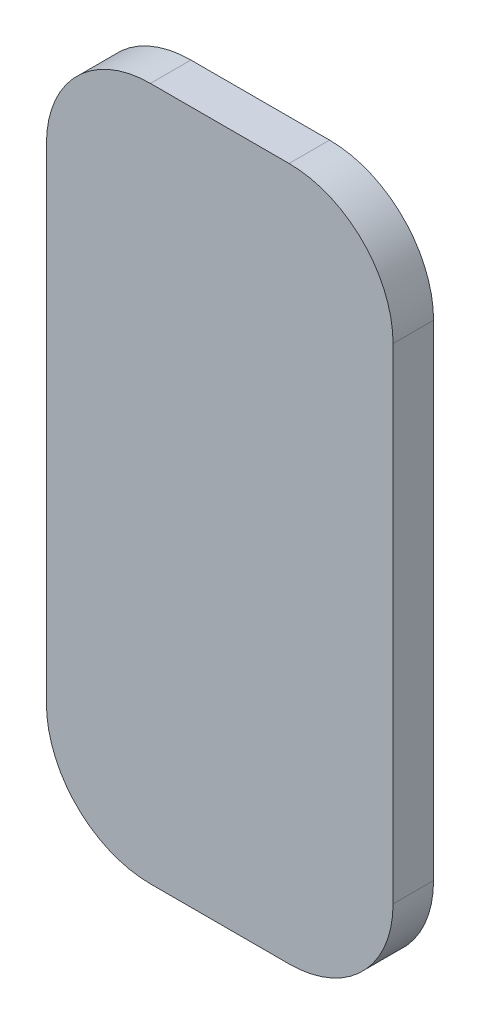
ISO-10303-21;
HEADER;
FILE_DESCRIPTION(('STEP AP214'),'2;1');
FILE_NAME('part.step','',(''),(''),'','','');
FILE_SCHEMA(('AUTOMOTIVE_DESIGN { 1 0 10303 214 1 1 1 1 }'));
ENDSEC;
DATA;
#1=APPLICATION_CONTEXT('core data for automotive mechanical design processes');
#2=APPLICATION_PROTOCOL_DEFINITION('international standard','automotive_design',2000,#1);
#3=PRODUCT_CONTEXT('',#1,'mechanical');
#4=PRODUCT('Part','Part','',(#3));
#5=PRODUCT_RELATED_PRODUCT_CATEGORY('part','',(#4));
#6=PRODUCT_DEFINITION_FORMATION('','',#4);
#7=PRODUCT_DEFINITION_CONTEXT('part definition',#1,'design');
#8=PRODUCT_DEFINITION('design','',#6,#7);
#9=PRODUCT_DEFINITION_SHAPE('','',#8);
#10=(LENGTH_UNIT() NAMED_UNIT(*) SI_UNIT(.MILLI.,.METRE.));
#11=(NAMED_UNIT(*) PLANE_ANGLE_UNIT() SI_UNIT($,.RADIAN.));
#12=(NAMED_UNIT(*) SI_UNIT($,.STERADIAN.) SOLID_ANGLE_UNIT());
#13=UNCERTAINTY_MEASURE_WITH_UNIT(LENGTH_MEASURE(1.E-05),#10,'distance_accuracy_value','');
#14=(GEOMETRIC_REPRESENTATION_CONTEXT(3) GLOBAL_UNCERTAINTY_ASSIGNED_CONTEXT((#13)) GLOBAL_UNIT_ASSIGNED_CONTEXT((#10,
#11,#12)) REPRESENTATION_CONTEXT('',''));
#15=CARTESIAN_POINT('',(0.,0.,0.));
#16=DIRECTION('',(0.,0.,1.));
#17=DIRECTION('',(1.,0.,0.));
#18=AXIS2_PLACEMENT_3D('',#15,#16,#17);
#19=CARTESIAN_POINT('',(0.,0.,-1.1684));
#20=DIRECTION('',(-1.,0.,0.));
#21=DIRECTION('',(0.,-1.,0.));
#22=AXIS2_PLACEMENT_3D('',#19,#20,#21);
#23=PLANE('',#22);
#24=DIRECTION('',(0.,-1.,0.));
#25=VECTOR('',#24,1.);
#26=CARTESIAN_POINT('',(0.,0.,0.));
#27=LINE('',#26,#25);
#28=CARTESIAN_POINT('',(0.,17.,0.));
#29=VERTEX_POINT('',#28);
#30=CARTESIAN_POINT('',(0.,3.,0.));
#31=VERTEX_POINT('',#30);
#32=EDGE_CURVE('E162',#29,#31,#27,.T.);
#33=ORIENTED_EDGE('',*,*,#32,.F.);
#34=DIRECTION('',(0.,0.,1.));
#35=VECTOR('',#34,1.);
#36=CARTESIAN_POINT('',(0.,17.,-1.1684));
#37=LINE('',#36,#35);
#38=CARTESIAN_POINT('',(0.,17.,-1.1684));
#39=VERTEX_POINT('',#38);
#40=EDGE_CURVE('E142',#29,#39,#37,.F.);
#41=ORIENTED_EDGE('',*,*,#40,.T.);
#42=DIRECTION('',(0.,-1.,0.));
#43=VECTOR('',#42,1.);
#44=CARTESIAN_POINT('',(0.,0.,-1.1684));
#45=LINE('',#44,#43);
#46=CARTESIAN_POINT('',(0.,3.,-1.1684));
#47=VERTEX_POINT('',#46);
#48=EDGE_CURVE('E123',#39,#47,#45,.T.);
#49=ORIENTED_EDGE('',*,*,#48,.T.);
#50=DIRECTION('',(0.,0.,1.));
#51=VECTOR('',#50,1.);
#52=CARTESIAN_POINT('',(0.,3.,-1.1684));
#53=LINE('',#52,#51);
#54=EDGE_CURVE('E139',#47,#31,#53,.T.);
#55=ORIENTED_EDGE('',*,*,#54,.T.);
#56=EDGE_LOOP('',(#33,#41,#49,#55));
#57=FACE_BOUND('',#56,.T.);
#58=ADVANCED_FACE('F37',(#57),#23,.T.);
#59=CARTESIAN_POINT('',(0.,20.,-1.1684));
#60=DIRECTION('',(0.,1.,0.));
#61=DIRECTION('',(0.,0.,1.));
#62=AXIS2_PLACEMENT_3D('',#59,#60,#61);
#63=PLANE('',#62);
#64=DIRECTION('',(-1.,0.,0.));
#65=VECTOR('',#64,1.);
#66=CARTESIAN_POINT('',(0.,20.,-1.1684));
#67=LINE('',#66,#65);
#68=CARTESIAN_POINT('',(7.,20.,-1.1684));
#69=VERTEX_POINT('',#68);
#70=CARTESIAN_POINT('',(3.,20.,-1.1684));
#71=VERTEX_POINT('',#70);
#72=EDGE_CURVE('E127',#69,#71,#67,.T.);
#73=ORIENTED_EDGE('',*,*,#72,.T.);
#74=DIRECTION('',(0.,0.,1.));
#75=VECTOR('',#74,1.);
#76=CARTESIAN_POINT('',(3.,20.,-1.1684));
#77=LINE('',#76,#75);
#78=CARTESIAN_POINT('',(3.,20.,0.));
#79=VERTEX_POINT('',#78);
#80=EDGE_CURVE('E114',#71,#79,#77,.T.);
#81=ORIENTED_EDGE('',*,*,#80,.T.);
#82=DIRECTION('',(-1.,0.,0.));
#83=VECTOR('',#82,1.);
#84=CARTESIAN_POINT('',(0.,20.,0.));
#85=LINE('',#84,#83);
#86=CARTESIAN_POINT('',(7.,20.,0.));
#87=VERTEX_POINT('',#86);
#88=EDGE_CURVE('E106',#87,#79,#85,.T.);
#89=ORIENTED_EDGE('',*,*,#88,.F.);
#90=DIRECTION('',(0.,0.,1.));
#91=VECTOR('',#90,1.);
#92=CARTESIAN_POINT('',(7.,20.,-1.1684));
#93=LINE('',#92,#91);
#94=EDGE_CURVE('E120',#87,#69,#93,.F.);
#95=ORIENTED_EDGE('',*,*,#94,.T.);
#96=EDGE_LOOP('',(#73,#81,#89,#95));
#97=FACE_BOUND('',#96,.T.);
#98=ADVANCED_FACE('F119',(#97),#63,.T.);
#99=CARTESIAN_POINT('',(10.,0.,-1.1684));
#100=DIRECTION('',(1.,0.,0.));
#101=DIRECTION('',(0.,1.,0.));
#102=AXIS2_PLACEMENT_3D('',#99,#100,#101);
#103=PLANE('',#102);
#104=DIRECTION('',(0.,1.,0.));
#105=VECTOR('',#104,1.);
#106=CARTESIAN_POINT('',(10.,0.,0.));
#107=LINE('',#106,#105);
#108=CARTESIAN_POINT('',(10.,3.,0.));
#109=VERTEX_POINT('',#108);
#110=CARTESIAN_POINT('',(10.,17.,0.));
#111=VERTEX_POINT('',#110);
#112=EDGE_CURVE('E108',#109,#111,#107,.T.);
#113=ORIENTED_EDGE('',*,*,#112,.F.);
#114=DIRECTION('',(0.,0.,1.));
#115=VECTOR('',#114,1.);
#116=CARTESIAN_POINT('',(10.,3.,-1.1684));
#117=LINE('',#116,#115);
#118=CARTESIAN_POINT('',(10.,3.,-1.1684));
#119=VERTEX_POINT('',#118);
#120=EDGE_CURVE('E11',#109,#119,#117,.F.);
#121=ORIENTED_EDGE('',*,*,#120,.T.);
#122=DIRECTION('',(0.,1.,0.));
#123=VECTOR('',#122,1.);
#124=CARTESIAN_POINT('',(10.,0.,-1.1684));
#125=LINE('',#124,#123);
#126=CARTESIAN_POINT('',(10.,17.,-1.1684));
#127=VERTEX_POINT('',#126);
#128=EDGE_CURVE('E130',#119,#127,#125,.T.);
#129=ORIENTED_EDGE('',*,*,#128,.T.);
#130=DIRECTION('',(0.,0.,1.));
#131=VECTOR('',#130,1.);
#132=CARTESIAN_POINT('',(10.,17.,-1.1684));
#133=LINE('',#132,#131);
#134=EDGE_CURVE('E45',#127,#111,#133,.T.);
#135=ORIENTED_EDGE('',*,*,#134,.T.);
#136=EDGE_LOOP('',(#113,#121,#129,#135));
#137=FACE_BOUND('',#136,.T.);
#138=ADVANCED_FACE('F155',(#137),#103,.T.);
#139=CARTESIAN_POINT('',(0.,0.,-1.1684));
#140=DIRECTION('',(0.,-1.,0.));
#141=DIRECTION('',(0.,0.,-1.));
#142=AXIS2_PLACEMENT_3D('',#139,#140,#141);
#143=PLANE('',#142);
#144=DIRECTION('',(1.,0.,0.));
#145=VECTOR('',#144,1.);
#146=CARTESIAN_POINT('',(0.,0.,0.));
#147=LINE('',#146,#145);
#148=CARTESIAN_POINT('',(3.,0.,0.));
#149=VERTEX_POINT('',#148);
#150=CARTESIAN_POINT('',(7.,0.,0.));
#151=VERTEX_POINT('',#150);
#152=EDGE_CURVE('E165',#149,#151,#147,.T.);
#153=ORIENTED_EDGE('',*,*,#152,.F.);
#154=DIRECTION('',(0.,0.,1.));
#155=VECTOR('',#154,1.);
#156=CARTESIAN_POINT('',(3.,0.,-1.1684));
#157=LINE('',#156,#155);
#158=CARTESIAN_POINT('',(3.,0.,-1.1684));
#159=VERTEX_POINT('',#158);
#160=EDGE_CURVE('E59',#149,#159,#157,.F.);
#161=ORIENTED_EDGE('',*,*,#160,.T.);
#162=DIRECTION('',(1.,0.,0.));
#163=VECTOR('',#162,1.);
#164=CARTESIAN_POINT('',(0.,0.,-1.1684));
#165=LINE('',#164,#163);
#166=CARTESIAN_POINT('',(7.,0.,-1.1684));
#167=VERTEX_POINT('',#166);
#168=EDGE_CURVE('E157',#159,#167,#165,.T.);
#169=ORIENTED_EDGE('',*,*,#168,.T.);
#170=DIRECTION('',(0.,0.,1.));
#171=VECTOR('',#170,1.);
#172=CARTESIAN_POINT('',(7.,0.,-1.1684));
#173=LINE('',#172,#171);
#174=EDGE_CURVE('E150',#167,#151,#173,.T.);
#175=ORIENTED_EDGE('',*,*,#174,.T.);
#176=EDGE_LOOP('',(#153,#161,#169,#175));
#177=FACE_BOUND('',#176,.T.);
#178=ADVANCED_FACE('F167',(#177),#143,.T.);
#179=CARTESIAN_POINT('',(0.,0.,-1.1684));
#180=DIRECTION('',(0.,0.,-1.));
#181=DIRECTION('',(-1.,0.,0.));
#182=AXIS2_PLACEMENT_3D('',#179,#180,#181);
#183=PLANE('',#182);
#184=ORIENTED_EDGE('',*,*,#48,.F.);
#185=CARTESIAN_POINT('',(3.,17.,-1.1684));
#186=DIRECTION('',(0.,0.,-1.));
#187=DIRECTION('',(-1.,0.,0.));
#188=AXIS2_PLACEMENT_3D('',#185,#186,#187);
#189=CIRCLE('',#188,3.);
#190=EDGE_CURVE('E148',#39,#71,#189,.T.);
#191=ORIENTED_EDGE('',*,*,#190,.T.);
#192=ORIENTED_EDGE('',*,*,#72,.F.);
#193=CARTESIAN_POINT('',(7.,17.,-1.1684));
#194=DIRECTION('',(0.,0.,-1.));
#195=DIRECTION('',(-1.,0.,0.));
#196=AXIS2_PLACEMENT_3D('',#193,#194,#195);
#197=CIRCLE('',#196,3.);
#198=EDGE_CURVE('E126',#69,#127,#197,.T.);
#199=ORIENTED_EDGE('',*,*,#198,.T.);
#200=ORIENTED_EDGE('',*,*,#128,.F.);
#201=CARTESIAN_POINT('',(7.,3.,-1.1684));
#202=DIRECTION('',(0.,0.,-1.));
#203=DIRECTION('',(-1.,0.,0.));
#204=AXIS2_PLACEMENT_3D('',#201,#202,#203);
#205=CIRCLE('',#204,3.);
#206=EDGE_CURVE('E52',#119,#167,#205,.T.);
#207=ORIENTED_EDGE('',*,*,#206,.T.);
#208=ORIENTED_EDGE('',*,*,#168,.F.);
#209=CARTESIAN_POINT('',(3.,3.,-1.1684));
#210=DIRECTION('',(0.,0.,-1.));
#211=DIRECTION('',(-1.,0.,0.));
#212=AXIS2_PLACEMENT_3D('',#209,#210,#211);
#213=CIRCLE('',#212,3.);
#214=EDGE_CURVE('E146',#159,#47,#213,.T.);
#215=ORIENTED_EDGE('',*,*,#214,.T.);
#216=EDGE_LOOP('',(#184,#191,#192,#199,#200,#207,#208,#215));
#217=FACE_BOUND('',#216,.T.);
#218=ADVANCED_FACE('F175',(#217),#183,.T.);
#219=CARTESIAN_POINT('',(0.,0.,0.));
#220=DIRECTION('',(0.,0.,-1.));
#221=DIRECTION('',(-1.,0.,0.));
#222=AXIS2_PLACEMENT_3D('',#219,#220,#221);
#223=PLANE('',#222);
#224=ORIENTED_EDGE('',*,*,#88,.T.);
#225=CARTESIAN_POINT('',(3.,17.,0.));
#226=DIRECTION('',(0.,0.,-1.));
#227=DIRECTION('',(-1.,0.,0.));
#228=AXIS2_PLACEMENT_3D('',#225,#226,#227);
#229=CIRCLE('',#228,3.);
#230=EDGE_CURVE('E137',#79,#29,#229,.F.);
#231=ORIENTED_EDGE('',*,*,#230,.T.);
#232=ORIENTED_EDGE('',*,*,#32,.T.);
#233=CARTESIAN_POINT('',(3.,3.,0.));
#234=DIRECTION('',(0.,0.,-1.));
#235=DIRECTION('',(-1.,0.,0.));
#236=AXIS2_PLACEMENT_3D('',#233,#234,#235);
#237=CIRCLE('',#236,3.);
#238=EDGE_CURVE('E135',#31,#149,#237,.F.);
#239=ORIENTED_EDGE('',*,*,#238,.T.);
#240=ORIENTED_EDGE('',*,*,#152,.T.);
#241=CARTESIAN_POINT('',(7.,3.,0.));
#242=DIRECTION('',(0.,0.,-1.));
#243=DIRECTION('',(-1.,0.,0.));
#244=AXIS2_PLACEMENT_3D('',#241,#242,#243);
#245=CIRCLE('',#244,3.);
#246=EDGE_CURVE('E113',#151,#109,#245,.F.);
#247=ORIENTED_EDGE('',*,*,#246,.T.);
#248=ORIENTED_EDGE('',*,*,#112,.T.);
#249=CARTESIAN_POINT('',(7.,17.,0.));
#250=DIRECTION('',(0.,0.,-1.));
#251=DIRECTION('',(-1.,0.,0.));
#252=AXIS2_PLACEMENT_3D('',#249,#250,#251);
#253=CIRCLE('',#252,3.);
#254=EDGE_CURVE('E103',#111,#87,#253,.F.);
#255=ORIENTED_EDGE('',*,*,#254,.T.);
#256=EDGE_LOOP('',(#224,#231,#232,#239,#240,#247,#248,#255));
#257=FACE_BOUND('',#256,.T.);
#258=ADVANCED_FACE('F105',(#257),#223,.F.);
#259=CARTESIAN_POINT('',(3.,17.,-1.1684));
#260=DIRECTION('',(0.,0.,1.));
#261=DIRECTION('',(1.,0.,0.));
#262=AXIS2_PLACEMENT_3D('',#259,#260,#261);
#263=CYLINDRICAL_SURFACE('',#262,3.);
#264=ORIENTED_EDGE('',*,*,#190,.F.);
#265=ORIENTED_EDGE('',*,*,#40,.F.);
#266=ORIENTED_EDGE('',*,*,#230,.F.);
#267=ORIENTED_EDGE('',*,*,#80,.F.);
#268=EDGE_LOOP('',(#264,#265,#266,#267));
#269=FACE_BOUND('',#268,.T.);
#270=ADVANCED_FACE('F181',(#269),#263,.T.);
#271=CARTESIAN_POINT('',(3.,3.,-1.1684));
#272=DIRECTION('',(0.,0.,1.));
#273=DIRECTION('',(1.,0.,0.));
#274=AXIS2_PLACEMENT_3D('',#271,#272,#273);
#275=CYLINDRICAL_SURFACE('',#274,3.);
#276=ORIENTED_EDGE('',*,*,#214,.F.);
#277=ORIENTED_EDGE('',*,*,#160,.F.);
#278=ORIENTED_EDGE('',*,*,#238,.F.);
#279=ORIENTED_EDGE('',*,*,#54,.F.);
#280=EDGE_LOOP('',(#276,#277,#278,#279));
#281=FACE_BOUND('',#280,.T.);
#282=ADVANCED_FACE('F171',(#281),#275,.T.);
#283=CARTESIAN_POINT('',(7.,3.,-1.1684));
#284=DIRECTION('',(0.,0.,1.));
#285=DIRECTION('',(1.,0.,0.));
#286=AXIS2_PLACEMENT_3D('',#283,#284,#285);
#287=CYLINDRICAL_SURFACE('',#286,3.);
#288=ORIENTED_EDGE('',*,*,#206,.F.);
#289=ORIENTED_EDGE('',*,*,#120,.F.);
#290=ORIENTED_EDGE('',*,*,#246,.F.);
#291=ORIENTED_EDGE('',*,*,#174,.F.);
#292=EDGE_LOOP('',(#288,#289,#290,#291));
#293=FACE_BOUND('',#292,.T.);
#294=ADVANCED_FACE('F188',(#293),#287,.T.);
#295=CARTESIAN_POINT('',(7.,17.,-1.1684));
#296=DIRECTION('',(0.,0.,1.));
#297=DIRECTION('',(1.,0.,0.));
#298=AXIS2_PLACEMENT_3D('',#295,#296,#297);
#299=CYLINDRICAL_SURFACE('',#298,3.);
#300=ORIENTED_EDGE('',*,*,#198,.F.);
#301=ORIENTED_EDGE('',*,*,#94,.F.);
#302=ORIENTED_EDGE('',*,*,#254,.F.);
#303=ORIENTED_EDGE('',*,*,#134,.F.);
#304=EDGE_LOOP('',(#300,#301,#302,#303));
#305=FACE_BOUND('',#304,.T.);
#306=ADVANCED_FACE('F39',(#305),#299,.T.);
#307=CLOSED_SHELL('',(#58,#98,#138,#178,#218,#258,#270,#282,#294,#306));
#308=MANIFOLD_SOLID_BREP('B2',#307);
#309=ADVANCED_BREP_SHAPE_REPRESENTATION('',(#18,#308),#14);
#310=SHAPE_DEFINITION_REPRESENTATION(#9,#309);
ENDSEC;
END-ISO-10303-21;
